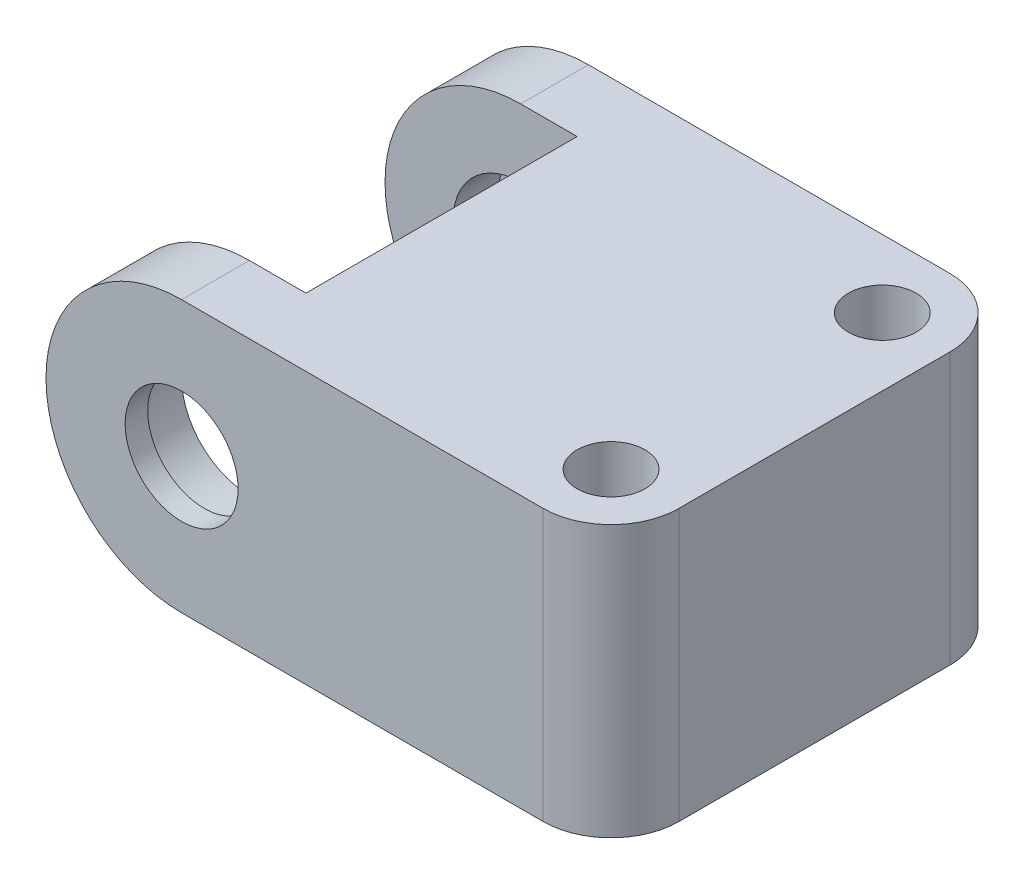
ISO-10303-21;
HEADER;
FILE_DESCRIPTION(('STEP AP214'),'2;1');
FILE_NAME('part.step','',(''),(''),'','','');
FILE_SCHEMA(('AUTOMOTIVE_DESIGN { 1 0 10303 214 1 1 1 1 }'));
ENDSEC;
DATA;
#1=APPLICATION_CONTEXT('core data for automotive mechanical design processes');
#2=APPLICATION_PROTOCOL_DEFINITION('international standard','automotive_design',2000,#1);
#3=PRODUCT_CONTEXT('',#1,'mechanical');
#4=PRODUCT('Part','Part','',(#3));
#5=PRODUCT_RELATED_PRODUCT_CATEGORY('part','',(#4));
#6=PRODUCT_DEFINITION_FORMATION('','',#4);
#7=PRODUCT_DEFINITION_CONTEXT('part definition',#1,'design');
#8=PRODUCT_DEFINITION('design','',#6,#7);
#9=PRODUCT_DEFINITION_SHAPE('','',#8);
#10=(LENGTH_UNIT() NAMED_UNIT(*) SI_UNIT(.MILLI.,.METRE.));
#11=(NAMED_UNIT(*) PLANE_ANGLE_UNIT() SI_UNIT($,.RADIAN.));
#12=(NAMED_UNIT(*) SI_UNIT($,.STERADIAN.) SOLID_ANGLE_UNIT());
#13=UNCERTAINTY_MEASURE_WITH_UNIT(LENGTH_MEASURE(1.E-05),#10,'distance_accuracy_value','');
#14=(GEOMETRIC_REPRESENTATION_CONTEXT(3) GLOBAL_UNCERTAINTY_ASSIGNED_CONTEXT((#13)) GLOBAL_UNIT_ASSIGNED_CONTEXT((#10,
#11,#12)) REPRESENTATION_CONTEXT('',''));
#15=CARTESIAN_POINT('',(0.,0.,0.));
#16=DIRECTION('',(0.,0.,1.));
#17=DIRECTION('',(1.,0.,0.));
#18=AXIS2_PLACEMENT_3D('',#15,#16,#17);
#19=CARTESIAN_POINT('',(0.,0.,9.));
#20=DIRECTION('',(0.,0.,-1.));
#21=DIRECTION('',(-1.,0.,0.));
#22=AXIS2_PLACEMENT_3D('',#19,#20,#21);
#23=CYLINDRICAL_SURFACE('',#22,6.);
#24=CARTESIAN_POINT('',(0.,0.,-6.));
#25=DIRECTION('',(0.,0.,-1.));
#26=DIRECTION('',(-1.,0.,0.));
#27=AXIS2_PLACEMENT_3D('',#24,#25,#26);
#28=CIRCLE('',#27,6.);
#29=CARTESIAN_POINT('',(0.,-6.,-6.));
#30=VERTEX_POINT('',#29);
#31=CARTESIAN_POINT('',(0.,6.,-6.));
#32=VERTEX_POINT('',#31);
#33=EDGE_CURVE('E184',#30,#32,#28,.T.);
#34=ORIENTED_EDGE('',*,*,#33,.T.);
#35=DIRECTION('',(0.,0.,1.));
#36=VECTOR('',#35,1.);
#37=CARTESIAN_POINT('',(0.,6.,9.));
#38=LINE('',#37,#36);
#39=CARTESIAN_POINT('',(0.,6.,-9.));
#40=VERTEX_POINT('',#39);
#41=EDGE_CURVE('E236',#40,#32,#38,.T.);
#42=ORIENTED_EDGE('',*,*,#41,.F.);
#43=CARTESIAN_POINT('',(0.,0.,-9.));
#44=DIRECTION('',(0.,0.,1.));
#45=DIRECTION('',(1.,0.,0.));
#46=AXIS2_PLACEMENT_3D('',#43,#44,#45);
#47=CIRCLE('',#46,6.);
#48=CARTESIAN_POINT('',(0.,-6.,-9.));
#49=VERTEX_POINT('',#48);
#50=EDGE_CURVE('E47',#40,#49,#47,.T.);
#51=ORIENTED_EDGE('',*,*,#50,.T.);
#52=DIRECTION('',(0.,0.,1.));
#53=VECTOR('',#52,1.);
#54=CARTESIAN_POINT('',(0.,-6.,9.));
#55=LINE('',#54,#53);
#56=EDGE_CURVE('E260',#49,#30,#55,.T.);
#57=ORIENTED_EDGE('',*,*,#56,.T.);
#58=EDGE_LOOP('',(#34,#42,#51,#57));
#59=FACE_BOUND('',#58,.T.);
#60=ADVANCED_FACE('F44',(#59),#23,.T.);
#61=CARTESIAN_POINT('',(16.,6.,-6.));
#62=DIRECTION('',(0.,-1.,0.));
#63=DIRECTION('',(0.,0.,-1.));
#64=AXIS2_PLACEMENT_3D('',#61,#62,#63);
#65=PLANE('',#64);
#66=CARTESIAN_POINT('',(16.,6.,6.));
#67=DIRECTION('',(0.,1.,0.));
#68=DIRECTION('',(0.,0.,1.));
#69=AXIS2_PLACEMENT_3D('',#66,#67,#68);
#70=CIRCLE('',#69,1.5);
#71=CARTESIAN_POINT('',(16.,6.,7.5));
#72=VERTEX_POINT('',#71);
#73=EDGE_CURVE('E218',#72,#72,#70,.T.);
#74=ORIENTED_EDGE('',*,*,#73,.F.);
#75=EDGE_LOOP('',(#74));
#76=FACE_BOUND('',#75,.T.);
#77=CARTESIAN_POINT('',(16.,6.,-6.));
#78=DIRECTION('',(0.,1.,0.));
#79=DIRECTION('',(0.,0.,1.));
#80=AXIS2_PLACEMENT_3D('',#77,#78,#79);
#81=CIRCLE('',#80,1.5);
#82=CARTESIAN_POINT('',(16.,6.,-4.5));
#83=VERTEX_POINT('',#82);
#84=EDGE_CURVE('E226',#83,#83,#81,.T.);
#85=ORIENTED_EDGE('',*,*,#84,.F.);
#86=EDGE_LOOP('',(#85));
#87=FACE_BOUND('',#86,.T.);
#88=DIRECTION('',(-1.,0.,0.));
#89=VECTOR('',#88,1.);
#90=CARTESIAN_POINT('',(-6.,6.,-6.));
#91=LINE('',#90,#89);
#92=CARTESIAN_POINT('',(2.5,6.,-6.));
#93=VERTEX_POINT('',#92);
#94=EDGE_CURVE('E148',#93,#32,#91,.T.);
#95=ORIENTED_EDGE('',*,*,#94,.F.);
#96=DIRECTION('',(0.,0.,-1.));
#97=VECTOR('',#96,1.);
#98=CARTESIAN_POINT('',(2.5,6.,-6.));
#99=LINE('',#98,#97);
#100=CARTESIAN_POINT('',(2.5,6.,6.));
#101=VERTEX_POINT('',#100);
#102=EDGE_CURVE('E147',#101,#93,#99,.T.);
#103=ORIENTED_EDGE('',*,*,#102,.F.);
#104=DIRECTION('',(1.,0.,0.));
#105=VECTOR('',#104,1.);
#106=CARTESIAN_POINT('',(2.5,6.,6.));
#107=LINE('',#106,#105);
#108=CARTESIAN_POINT('',(0.,6.,6.));
#109=VERTEX_POINT('',#108);
#110=EDGE_CURVE('E139',#109,#101,#107,.T.);
#111=ORIENTED_EDGE('',*,*,#110,.F.);
#112=CARTESIAN_POINT('',(0.,6.,9.));
#113=VERTEX_POINT('',#112);
#114=EDGE_CURVE('E239',#109,#113,#38,.T.);
#115=ORIENTED_EDGE('',*,*,#114,.T.);
#116=DIRECTION('',(1.,0.,0.));
#117=VECTOR('',#116,1.);
#118=CARTESIAN_POINT('',(16.,6.,9.));
#119=LINE('',#118,#117);
#120=CARTESIAN_POINT('',(16.,6.,9.));
#121=VERTEX_POINT('',#120);
#122=EDGE_CURVE('E237',#113,#121,#119,.T.);
#123=ORIENTED_EDGE('',*,*,#122,.T.);
#124=CARTESIAN_POINT('',(16.,6.,6.));
#125=DIRECTION('',(0.,1.,0.));
#126=DIRECTION('',(0.,0.,-1.));
#127=AXIS2_PLACEMENT_3D('',#124,#125,#126);
#128=CIRCLE('',#127,3.);
#129=CARTESIAN_POINT('',(19.,6.,6.));
#130=VERTEX_POINT('',#129);
#131=EDGE_CURVE('E243',#121,#130,#128,.T.);
#132=ORIENTED_EDGE('',*,*,#131,.T.);
#133=DIRECTION('',(0.,0.,-1.));
#134=VECTOR('',#133,1.);
#135=CARTESIAN_POINT('',(19.,6.,-6.));
#136=LINE('',#135,#134);
#137=CARTESIAN_POINT('',(19.,6.,-6.));
#138=VERTEX_POINT('',#137);
#139=EDGE_CURVE('E246',#130,#138,#136,.T.);
#140=ORIENTED_EDGE('',*,*,#139,.T.);
#141=CARTESIAN_POINT('',(16.,6.,-6.));
#142=DIRECTION('',(0.,1.,0.));
#143=DIRECTION('',(0.,0.,-1.));
#144=AXIS2_PLACEMENT_3D('',#141,#142,#143);
#145=CIRCLE('',#144,3.);
#146=CARTESIAN_POINT('',(16.,6.,-9.));
#147=VERTEX_POINT('',#146);
#148=EDGE_CURVE('E248',#138,#147,#145,.T.);
#149=ORIENTED_EDGE('',*,*,#148,.T.);
#150=DIRECTION('',(-1.,0.,0.));
#151=VECTOR('',#150,1.);
#152=CARTESIAN_POINT('',(0.,6.,-9.));
#153=LINE('',#152,#151);
#154=EDGE_CURVE('E255',#147,#40,#153,.T.);
#155=ORIENTED_EDGE('',*,*,#154,.T.);
#156=ORIENTED_EDGE('',*,*,#41,.T.);
#157=EDGE_LOOP('',(#95,#103,#111,#115,#123,#132,#140,#149,#155,#156));
#158=FACE_BOUND('',#157,.T.);
#159=ADVANCED_FACE('F160',(#76,#87,#158),#65,.F.);
#160=CARTESIAN_POINT('',(16.,-6.,-6.));
#161=DIRECTION('',(0.,-1.,0.));
#162=DIRECTION('',(0.,0.,-1.));
#163=AXIS2_PLACEMENT_3D('',#160,#161,#162);
#164=PLANE('',#163);
#165=CARTESIAN_POINT('',(16.,-6.,-6.));
#166=DIRECTION('',(0.,1.,0.));
#167=DIRECTION('',(0.,0.,1.));
#168=AXIS2_PLACEMENT_3D('',#165,#166,#167);
#169=CIRCLE('',#168,1.5);
#170=CARTESIAN_POINT('',(16.,-6.,-4.5));
#171=VERTEX_POINT('',#170);
#172=EDGE_CURVE('E223',#171,#171,#169,.T.);
#173=ORIENTED_EDGE('',*,*,#172,.T.);
#174=EDGE_LOOP('',(#173));
#175=FACE_BOUND('',#174,.T.);
#176=CARTESIAN_POINT('',(16.,-6.,6.));
#177=DIRECTION('',(0.,1.,0.));
#178=DIRECTION('',(0.,0.,1.));
#179=AXIS2_PLACEMENT_3D('',#176,#177,#178);
#180=CIRCLE('',#179,1.5);
#181=CARTESIAN_POINT('',(16.,-6.,7.5));
#182=VERTEX_POINT('',#181);
#183=EDGE_CURVE('E216',#182,#182,#180,.T.);
#184=ORIENTED_EDGE('',*,*,#183,.T.);
#185=EDGE_LOOP('',(#184));
#186=FACE_BOUND('',#185,.T.);
#187=DIRECTION('',(0.,0.,-1.));
#188=VECTOR('',#187,1.);
#189=CARTESIAN_POINT('',(2.5,-6.,-6.));
#190=LINE('',#189,#188);
#191=CARTESIAN_POINT('',(2.5,-6.,6.));
#192=VERTEX_POINT('',#191);
#193=CARTESIAN_POINT('',(2.5,-6.,-6.));
#194=VERTEX_POINT('',#193);
#195=EDGE_CURVE('E159',#192,#194,#190,.T.);
#196=ORIENTED_EDGE('',*,*,#195,.T.);
#197=DIRECTION('',(-1.,0.,0.));
#198=VECTOR('',#197,1.);
#199=CARTESIAN_POINT('',(-6.,-6.,-6.));
#200=LINE('',#199,#198);
#201=EDGE_CURVE('E61',#194,#30,#200,.T.);
#202=ORIENTED_EDGE('',*,*,#201,.T.);
#203=ORIENTED_EDGE('',*,*,#56,.F.);
#204=DIRECTION('',(-1.,0.,0.));
#205=VECTOR('',#204,1.);
#206=CARTESIAN_POINT('',(0.,-6.,-9.));
#207=LINE('',#206,#205);
#208=CARTESIAN_POINT('',(16.,-6.,-9.));
#209=VERTEX_POINT('',#208);
#210=EDGE_CURVE('E271',#209,#49,#207,.T.);
#211=ORIENTED_EDGE('',*,*,#210,.F.);
#212=CARTESIAN_POINT('',(16.,-6.,-6.));
#213=DIRECTION('',(0.,1.,0.));
#214=DIRECTION('',(0.,0.,-1.));
#215=AXIS2_PLACEMENT_3D('',#212,#213,#214);
#216=CIRCLE('',#215,3.);
#217=CARTESIAN_POINT('',(19.,-6.,-6.));
#218=VERTEX_POINT('',#217);
#219=EDGE_CURVE('E267',#218,#209,#216,.T.);
#220=ORIENTED_EDGE('',*,*,#219,.F.);
#221=DIRECTION('',(0.,0.,-1.));
#222=VECTOR('',#221,1.);
#223=CARTESIAN_POINT('',(19.,-6.,-6.));
#224=LINE('',#223,#222);
#225=CARTESIAN_POINT('',(19.,-6.,6.));
#226=VERTEX_POINT('',#225);
#227=EDGE_CURVE('E266',#226,#218,#224,.T.);
#228=ORIENTED_EDGE('',*,*,#227,.F.);
#229=CARTESIAN_POINT('',(16.,-6.,6.));
#230=DIRECTION('',(0.,1.,0.));
#231=DIRECTION('',(0.,0.,-1.));
#232=AXIS2_PLACEMENT_3D('',#229,#230,#231);
#233=CIRCLE('',#232,3.);
#234=CARTESIAN_POINT('',(16.,-6.,9.));
#235=VERTEX_POINT('',#234);
#236=EDGE_CURVE('E261',#235,#226,#233,.T.);
#237=ORIENTED_EDGE('',*,*,#236,.F.);
#238=DIRECTION('',(1.,0.,0.));
#239=VECTOR('',#238,1.);
#240=CARTESIAN_POINT('',(16.,-6.,9.));
#241=LINE('',#240,#239);
#242=CARTESIAN_POINT('',(0.,-6.,9.));
#243=VERTEX_POINT('',#242);
#244=EDGE_CURVE('E262',#243,#235,#241,.T.);
#245=ORIENTED_EDGE('',*,*,#244,.F.);
#246=CARTESIAN_POINT('',(0.,-6.,6.));
#247=VERTEX_POINT('',#246);
#248=EDGE_CURVE('E235',#247,#243,#55,.T.);
#249=ORIENTED_EDGE('',*,*,#248,.F.);
#250=DIRECTION('',(1.,0.,0.));
#251=VECTOR('',#250,1.);
#252=CARTESIAN_POINT('',(2.5,-6.,6.));
#253=LINE('',#252,#251);
#254=EDGE_CURVE('E165',#247,#192,#253,.T.);
#255=ORIENTED_EDGE('',*,*,#254,.T.);
#256=EDGE_LOOP('',(#196,#202,#203,#211,#220,#228,#237,#245,#249,#255));
#257=FACE_BOUND('',#256,.T.);
#258=ADVANCED_FACE('F308',(#175,#186,#257),#164,.T.);
#259=CARTESIAN_POINT('',(0.,0.,9.));
#260=DIRECTION('',(0.,0.,-1.));
#261=DIRECTION('',(-1.,0.,0.));
#262=AXIS2_PLACEMENT_3D('',#259,#260,#261);
#263=CYLINDRICAL_SURFACE('',#262,2.5);
#264=CARTESIAN_POINT('',(0.,0.,-9.));
#265=DIRECTION('',(0.,0.,1.));
#266=DIRECTION('',(1.,0.,0.));
#267=AXIS2_PLACEMENT_3D('',#264,#265,#266);
#268=CIRCLE('',#267,2.5);
#269=CARTESIAN_POINT('',(2.5,0.,-9.));
#270=VERTEX_POINT('',#269);
#271=EDGE_CURVE('E292',#270,#270,#268,.T.);
#272=ORIENTED_EDGE('',*,*,#271,.F.);
#273=EDGE_LOOP('',(#272));
#274=FACE_BOUND('',#273,.T.);
#275=CARTESIAN_POINT('',(0.,0.,-8.));
#276=DIRECTION('',(0.,0.,-1.));
#277=DIRECTION('',(-1.,0.,0.));
#278=AXIS2_PLACEMENT_3D('',#275,#276,#277);
#279=CIRCLE('',#278,2.5);
#280=CARTESIAN_POINT('',(-2.5,0.,-8.));
#281=VERTEX_POINT('',#280);
#282=EDGE_CURVE('E214',#281,#281,#279,.T.);
#283=ORIENTED_EDGE('',*,*,#282,.F.);
#284=EDGE_LOOP('',(#283));
#285=FACE_BOUND('',#284,.T.);
#286=ADVANCED_FACE('F302',(#274,#285),#263,.F.);
#287=CARTESIAN_POINT('',(0.,0.,8.));
#288=DIRECTION('',(0.,0.,-1.));
#289=DIRECTION('',(-1.,0.,0.));
#290=AXIS2_PLACEMENT_3D('',#287,#288,#289);
#291=CIRCLE('',#290,2.5);
#292=CARTESIAN_POINT('',(-2.5,0.,8.));
#293=VERTEX_POINT('',#292);
#294=EDGE_CURVE('E189',#293,#293,#291,.T.);
#295=ORIENTED_EDGE('',*,*,#294,.T.);
#296=EDGE_LOOP('',(#295));
#297=FACE_BOUND('',#296,.T.);
#298=CARTESIAN_POINT('',(0.,0.,9.));
#299=DIRECTION('',(0.,0.,1.));
#300=DIRECTION('',(1.,0.,0.));
#301=AXIS2_PLACEMENT_3D('',#298,#299,#300);
#302=CIRCLE('',#301,2.5);
#303=CARTESIAN_POINT('',(2.5,0.,9.));
#304=VERTEX_POINT('',#303);
#305=EDGE_CURVE('E291',#304,#304,#302,.T.);
#306=ORIENTED_EDGE('',*,*,#305,.T.);
#307=EDGE_LOOP('',(#306));
#308=FACE_BOUND('',#307,.T.);
#309=ADVANCED_FACE('F310',(#297,#308),#263,.F.);
#310=ORIENTED_EDGE('',*,*,#114,.F.);
#311=CARTESIAN_POINT('',(0.,0.,6.));
#312=DIRECTION('',(0.,0.,1.));
#313=DIRECTION('',(1.,0.,0.));
#314=AXIS2_PLACEMENT_3D('',#311,#312,#313);
#315=CIRCLE('',#314,6.);
#316=EDGE_CURVE('E141',#109,#247,#315,.T.);
#317=ORIENTED_EDGE('',*,*,#316,.T.);
#318=ORIENTED_EDGE('',*,*,#248,.T.);
#319=CARTESIAN_POINT('',(0.,0.,9.));
#320=DIRECTION('',(0.,0.,1.));
#321=DIRECTION('',(1.,0.,0.));
#322=AXIS2_PLACEMENT_3D('',#319,#320,#321);
#323=CIRCLE('',#322,6.);
#324=EDGE_CURVE('E11',#113,#243,#323,.T.);
#325=ORIENTED_EDGE('',*,*,#324,.F.);
#326=EDGE_LOOP('',(#310,#317,#318,#325));
#327=FACE_BOUND('',#326,.T.);
#328=ADVANCED_FACE('F50',(#327),#23,.T.);
#329=CARTESIAN_POINT('',(0.,0.,9.));
#330=DIRECTION('',(0.,0.,1.));
#331=DIRECTION('',(1.,0.,0.));
#332=AXIS2_PLACEMENT_3D('',#329,#330,#331);
#333=PLANE('',#332);
#334=ORIENTED_EDGE('',*,*,#305,.F.);
#335=EDGE_LOOP('',(#334));
#336=FACE_BOUND('',#335,.T.);
#337=ORIENTED_EDGE('',*,*,#324,.T.);
#338=ORIENTED_EDGE('',*,*,#244,.T.);
#339=DIRECTION('',(0.,-1.,0.));
#340=VECTOR('',#339,1.);
#341=CARTESIAN_POINT('',(16.,6.,9.));
#342=LINE('',#341,#340);
#343=EDGE_CURVE('E290',#121,#235,#342,.T.);
#344=ORIENTED_EDGE('',*,*,#343,.F.);
#345=ORIENTED_EDGE('',*,*,#122,.F.);
#346=EDGE_LOOP('',(#337,#338,#344,#345));
#347=FACE_BOUND('',#346,.T.);
#348=ADVANCED_FACE('F350',(#336,#347),#333,.T.);
#349=CARTESIAN_POINT('',(0.,0.,-9.));
#350=DIRECTION('',(0.,0.,1.));
#351=DIRECTION('',(1.,0.,0.));
#352=AXIS2_PLACEMENT_3D('',#349,#350,#351);
#353=PLANE('',#352);
#354=ORIENTED_EDGE('',*,*,#271,.T.);
#355=EDGE_LOOP('',(#354));
#356=FACE_BOUND('',#355,.T.);
#357=ORIENTED_EDGE('',*,*,#50,.F.);
#358=ORIENTED_EDGE('',*,*,#154,.F.);
#359=DIRECTION('',(0.,-1.,0.));
#360=VECTOR('',#359,1.);
#361=CARTESIAN_POINT('',(16.,6.,-9.));
#362=LINE('',#361,#360);
#363=EDGE_CURVE('E256',#147,#209,#362,.T.);
#364=ORIENTED_EDGE('',*,*,#363,.T.);
#365=ORIENTED_EDGE('',*,*,#210,.T.);
#366=EDGE_LOOP('',(#357,#358,#364,#365));
#367=FACE_BOUND('',#366,.T.);
#368=ADVANCED_FACE('F301',(#356,#367),#353,.F.);
#369=CARTESIAN_POINT('',(16.,6.,6.));
#370=DIRECTION('',(0.,-1.,0.));
#371=DIRECTION('',(0.,0.,-1.));
#372=AXIS2_PLACEMENT_3D('',#369,#370,#371);
#373=CYLINDRICAL_SURFACE('',#372,3.);
#374=ORIENTED_EDGE('',*,*,#236,.T.);
#375=DIRECTION('',(0.,-1.,0.));
#376=VECTOR('',#375,1.);
#377=CARTESIAN_POINT('',(19.,6.,6.));
#378=LINE('',#377,#376);
#379=EDGE_CURVE('E281',#130,#226,#378,.T.);
#380=ORIENTED_EDGE('',*,*,#379,.F.);
#381=ORIENTED_EDGE('',*,*,#131,.F.);
#382=ORIENTED_EDGE('',*,*,#343,.T.);
#383=EDGE_LOOP('',(#374,#380,#381,#382));
#384=FACE_BOUND('',#383,.T.);
#385=ADVANCED_FACE('F354',(#384),#373,.T.);
#386=CARTESIAN_POINT('',(19.,6.,-6.));
#387=DIRECTION('',(-1.,0.,0.));
#388=DIRECTION('',(0.,0.,1.));
#389=AXIS2_PLACEMENT_3D('',#386,#387,#388);
#390=PLANE('',#389);
#391=ORIENTED_EDGE('',*,*,#227,.T.);
#392=DIRECTION('',(0.,-1.,0.));
#393=VECTOR('',#392,1.);
#394=CARTESIAN_POINT('',(19.,6.,-6.));
#395=LINE('',#394,#393);
#396=EDGE_CURVE('E279',#138,#218,#395,.T.);
#397=ORIENTED_EDGE('',*,*,#396,.F.);
#398=ORIENTED_EDGE('',*,*,#139,.F.);
#399=ORIENTED_EDGE('',*,*,#379,.T.);
#400=EDGE_LOOP('',(#391,#397,#398,#399));
#401=FACE_BOUND('',#400,.T.);
#402=ADVANCED_FACE('F357',(#401),#390,.F.);
#403=CARTESIAN_POINT('',(16.,6.,-6.));
#404=DIRECTION('',(0.,-1.,0.));
#405=DIRECTION('',(0.,0.,-1.));
#406=AXIS2_PLACEMENT_3D('',#403,#404,#405);
#407=CYLINDRICAL_SURFACE('',#406,3.);
#408=ORIENTED_EDGE('',*,*,#219,.T.);
#409=ORIENTED_EDGE('',*,*,#363,.F.);
#410=ORIENTED_EDGE('',*,*,#148,.F.);
#411=ORIENTED_EDGE('',*,*,#396,.T.);
#412=EDGE_LOOP('',(#408,#409,#410,#411));
#413=FACE_BOUND('',#412,.T.);
#414=ADVANCED_FACE('F363',(#413),#407,.T.);
#415=CARTESIAN_POINT('',(16.,6.,-6.));
#416=DIRECTION('',(0.,-1.,0.));
#417=DIRECTION('',(0.,0.,-1.));
#418=AXIS2_PLACEMENT_3D('',#415,#416,#417);
#419=CYLINDRICAL_SURFACE('',#418,1.5);
#420=ORIENTED_EDGE('',*,*,#84,.T.);
#421=EDGE_LOOP('',(#420));
#422=FACE_BOUND('',#421,.T.);
#423=ORIENTED_EDGE('',*,*,#172,.F.);
#424=EDGE_LOOP('',(#423));
#425=FACE_BOUND('',#424,.T.);
#426=ADVANCED_FACE('F397',(#422,#425),#419,.F.);
#427=CARTESIAN_POINT('',(16.,6.,6.));
#428=DIRECTION('',(0.,-1.,0.));
#429=DIRECTION('',(0.,0.,-1.));
#430=AXIS2_PLACEMENT_3D('',#427,#428,#429);
#431=CYLINDRICAL_SURFACE('',#430,1.5);
#432=ORIENTED_EDGE('',*,*,#73,.T.);
#433=EDGE_LOOP('',(#432));
#434=FACE_BOUND('',#433,.T.);
#435=ORIENTED_EDGE('',*,*,#183,.F.);
#436=EDGE_LOOP('',(#435));
#437=FACE_BOUND('',#436,.T.);
#438=ADVANCED_FACE('F317',(#434,#437),#431,.F.);
#439=CARTESIAN_POINT('',(2.5,0.,-8.));
#440=DIRECTION('',(0.,0.,1.));
#441=DIRECTION('',(1.,0.,0.));
#442=AXIS2_PLACEMENT_3D('',#439,#440,#441);
#443=PLANE('',#442);
#444=ORIENTED_EDGE('',*,*,#282,.T.);
#445=EDGE_LOOP('',(#444));
#446=FACE_BOUND('',#445,.T.);
#447=CARTESIAN_POINT('',(0.,0.,-8.));
#448=DIRECTION('',(0.,0.,-1.));
#449=DIRECTION('',(-1.,0.,0.));
#450=AXIS2_PLACEMENT_3D('',#447,#448,#449);
#451=CIRCLE('',#450,3.);
#452=CARTESIAN_POINT('',(-3.,0.,-8.));
#453=VERTEX_POINT('',#452);
#454=EDGE_CURVE('E211',#453,#453,#451,.T.);
#455=ORIENTED_EDGE('',*,*,#454,.F.);
#456=EDGE_LOOP('',(#455));
#457=FACE_BOUND('',#456,.T.);
#458=ADVANCED_FACE('F315',(#446,#457),#443,.T.);
#459=CARTESIAN_POINT('',(0.,0.,-12.234149703983));
#460=DIRECTION('',(0.,0.,-1.));
#461=DIRECTION('',(-1.,0.,0.));
#462=AXIS2_PLACEMENT_3D('',#459,#460,#461);
#463=CYLINDRICAL_SURFACE('',#462,3.);
#464=ORIENTED_EDGE('',*,*,#454,.T.);
#465=EDGE_LOOP('',(#464));
#466=FACE_BOUND('',#465,.T.);
#467=CARTESIAN_POINT('',(0.,0.,-6.));
#468=DIRECTION('',(0.,0.,-1.));
#469=DIRECTION('',(-1.,0.,0.));
#470=AXIS2_PLACEMENT_3D('',#467,#468,#469);
#471=CIRCLE('',#470,3.);
#472=CARTESIAN_POINT('',(-3.,0.,-6.));
#473=VERTEX_POINT('',#472);
#474=EDGE_CURVE('E210',#473,#473,#471,.T.);
#475=ORIENTED_EDGE('',*,*,#474,.F.);
#476=EDGE_LOOP('',(#475));
#477=FACE_BOUND('',#476,.T.);
#478=ADVANCED_FACE('F314',(#466,#477),#463,.F.);
#479=CARTESIAN_POINT('',(3.,0.,-6.));
#480=DIRECTION('',(0.,0.,1.));
#481=DIRECTION('',(1.,0.,0.));
#482=AXIS2_PLACEMENT_3D('',#479,#480,#481);
#483=PLANE('',#482);
#484=ORIENTED_EDGE('',*,*,#474,.T.);
#485=EDGE_LOOP('',(#484));
#486=FACE_BOUND('',#485,.T.);
#487=CARTESIAN_POINT('',(0.,0.,-6.));
#488=DIRECTION('',(0.,0.,-1.));
#489=DIRECTION('',(-1.,0.,0.));
#490=AXIS2_PLACEMENT_3D('',#487,#488,#489);
#491=CIRCLE('',#490,4.5);
#492=CARTESIAN_POINT('',(2.5,3.74165738677394,-6.));
#493=VERTEX_POINT('',#492);
#494=CARTESIAN_POINT('',(2.5,-3.74165738677394,-6.));
#495=VERTEX_POINT('',#494);
#496=EDGE_CURVE('E205',#493,#495,#491,.T.);
#497=ORIENTED_EDGE('',*,*,#496,.F.);
#498=DIRECTION('',(0.,1.,0.));
#499=VECTOR('',#498,1.);
#500=CARTESIAN_POINT('',(2.5,-6.,-6.));
#501=LINE('',#500,#499);
#502=EDGE_CURVE('E66',#493,#93,#501,.T.);
#503=ORIENTED_EDGE('',*,*,#502,.T.);
#504=ORIENTED_EDGE('',*,*,#94,.T.);
#505=ORIENTED_EDGE('',*,*,#33,.F.);
#506=ORIENTED_EDGE('',*,*,#201,.F.);
#507=EDGE_CURVE('E172',#194,#495,#501,.T.);
#508=ORIENTED_EDGE('',*,*,#507,.T.);
#509=EDGE_LOOP('',(#497,#503,#504,#505,#506,#508));
#510=FACE_BOUND('',#509,.T.);
#511=ADVANCED_FACE('F325',(#486,#510),#483,.T.);
#512=CARTESIAN_POINT('',(0.,0.,-12.234149703983));
#513=DIRECTION('',(0.,0.,-1.));
#514=DIRECTION('',(-1.,0.,0.));
#515=AXIS2_PLACEMENT_3D('',#512,#513,#514);
#516=CYLINDRICAL_SURFACE('',#515,4.5);
#517=DIRECTION('',(0.,0.,-1.));
#518=VECTOR('',#517,1.);
#519=CARTESIAN_POINT('',(2.5,-3.74165738677394,-12.234149703983));
#520=LINE('',#519,#518);
#521=CARTESIAN_POINT('',(2.5,-3.74165738677394,6.));
#522=VERTEX_POINT('',#521);
#523=EDGE_CURVE('E185',#522,#495,#520,.T.);
#524=ORIENTED_EDGE('',*,*,#523,.F.);
#525=CARTESIAN_POINT('',(0.,0.,6.));
#526=DIRECTION('',(0.,0.,-1.));
#527=DIRECTION('',(-1.,0.,0.));
#528=AXIS2_PLACEMENT_3D('',#525,#526,#527);
#529=CIRCLE('',#528,4.5);
#530=CARTESIAN_POINT('',(2.5,3.74165738677394,6.));
#531=VERTEX_POINT('',#530);
#532=EDGE_CURVE('E198',#531,#522,#529,.T.);
#533=ORIENTED_EDGE('',*,*,#532,.F.);
#534=DIRECTION('',(0.,0.,-1.));
#535=VECTOR('',#534,1.);
#536=CARTESIAN_POINT('',(2.5,3.74165738677394,-12.234149703983));
#537=LINE('',#536,#535);
#538=EDGE_CURVE('E154',#493,#531,#537,.F.);
#539=ORIENTED_EDGE('',*,*,#538,.F.);
#540=ORIENTED_EDGE('',*,*,#496,.T.);
#541=EDGE_LOOP('',(#524,#533,#539,#540));
#542=FACE_BOUND('',#541,.T.);
#543=ADVANCED_FACE('F330',(#542),#516,.F.);
#544=CARTESIAN_POINT('',(4.5,0.,6.));
#545=DIRECTION('',(0.,0.,-1.));
#546=DIRECTION('',(-1.,0.,0.));
#547=AXIS2_PLACEMENT_3D('',#544,#545,#546);
#548=PLANE('',#547);
#549=CARTESIAN_POINT('',(0.,0.,6.));
#550=DIRECTION('',(0.,0.,-1.));
#551=DIRECTION('',(-1.,0.,0.));
#552=AXIS2_PLACEMENT_3D('',#549,#550,#551);
#553=CIRCLE('',#552,3.);
#554=CARTESIAN_POINT('',(-3.,0.,6.));
#555=VERTEX_POINT('',#554);
#556=EDGE_CURVE('E197',#555,#555,#553,.T.);
#557=ORIENTED_EDGE('',*,*,#556,.F.);
#558=EDGE_LOOP('',(#557));
#559=FACE_BOUND('',#558,.T.);
#560=ORIENTED_EDGE('',*,*,#532,.T.);
#561=DIRECTION('',(0.,1.,0.));
#562=VECTOR('',#561,1.);
#563=CARTESIAN_POINT('',(2.5,-6.,6.));
#564=LINE('',#563,#562);
#565=EDGE_CURVE('E153',#192,#522,#564,.T.);
#566=ORIENTED_EDGE('',*,*,#565,.F.);
#567=ORIENTED_EDGE('',*,*,#254,.F.);
#568=ORIENTED_EDGE('',*,*,#316,.F.);
#569=ORIENTED_EDGE('',*,*,#110,.T.);
#570=EDGE_CURVE('E137',#531,#101,#564,.T.);
#571=ORIENTED_EDGE('',*,*,#570,.F.);
#572=EDGE_LOOP('',(#560,#566,#567,#568,#569,#571));
#573=FACE_BOUND('',#572,.T.);
#574=ADVANCED_FACE('F138',(#559,#573),#548,.T.);
#575=CARTESIAN_POINT('',(0.,0.,-12.234149703983));
#576=DIRECTION('',(0.,0.,-1.));
#577=DIRECTION('',(-1.,0.,0.));
#578=AXIS2_PLACEMENT_3D('',#575,#576,#577);
#579=CYLINDRICAL_SURFACE('',#578,3.);
#580=ORIENTED_EDGE('',*,*,#556,.T.);
#581=EDGE_LOOP('',(#580));
#582=FACE_BOUND('',#581,.T.);
#583=CARTESIAN_POINT('',(0.,0.,8.));
#584=DIRECTION('',(0.,0.,-1.));
#585=DIRECTION('',(-1.,0.,0.));
#586=AXIS2_PLACEMENT_3D('',#583,#584,#585);
#587=CIRCLE('',#586,3.);
#588=CARTESIAN_POINT('',(-3.,0.,8.));
#589=VERTEX_POINT('',#588);
#590=EDGE_CURVE('E195',#589,#589,#587,.T.);
#591=ORIENTED_EDGE('',*,*,#590,.F.);
#592=EDGE_LOOP('',(#591));
#593=FACE_BOUND('',#592,.T.);
#594=ADVANCED_FACE('F413',(#582,#593),#579,.F.);
#595=CARTESIAN_POINT('',(3.,0.,8.));
#596=DIRECTION('',(0.,0.,-1.));
#597=DIRECTION('',(-1.,0.,0.));
#598=AXIS2_PLACEMENT_3D('',#595,#596,#597);
#599=PLANE('',#598);
#600=ORIENTED_EDGE('',*,*,#590,.T.);
#601=EDGE_LOOP('',(#600));
#602=FACE_BOUND('',#601,.T.);
#603=ORIENTED_EDGE('',*,*,#294,.F.);
#604=EDGE_LOOP('',(#603));
#605=FACE_BOUND('',#604,.T.);
#606=ADVANCED_FACE('F418',(#602,#605),#599,.T.);
#607=CARTESIAN_POINT('',(2.5,-6.,-6.));
#608=DIRECTION('',(1.,0.,0.));
#609=DIRECTION('',(0.,0.,-1.));
#610=AXIS2_PLACEMENT_3D('',#607,#608,#609);
#611=PLANE('',#610);
#612=ORIENTED_EDGE('',*,*,#523,.T.);
#613=ORIENTED_EDGE('',*,*,#507,.F.);
#614=ORIENTED_EDGE('',*,*,#195,.F.);
#615=ORIENTED_EDGE('',*,*,#565,.T.);
#616=EDGE_LOOP('',(#612,#613,#614,#615));
#617=FACE_BOUND('',#616,.T.);
#618=ADVANCED_FACE('F332',(#617),#611,.F.);
#619=ORIENTED_EDGE('',*,*,#538,.T.);
#620=ORIENTED_EDGE('',*,*,#570,.T.);
#621=ORIENTED_EDGE('',*,*,#102,.T.);
#622=ORIENTED_EDGE('',*,*,#502,.F.);
#623=EDGE_LOOP('',(#619,#620,#621,#622));
#624=FACE_BOUND('',#623,.T.);
#625=ADVANCED_FACE('F152',(#624),#611,.F.);
#626=CLOSED_SHELL('',(#60,#159,#258,#286,#309,#328,#348,#368,#385,#402,#414,#426,#438,#458,#478,
#511,#543,#574,#594,#606,#618,#625));
#627=MANIFOLD_SOLID_BREP('B2',#626);
#628=ADVANCED_BREP_SHAPE_REPRESENTATION('',(#18,#627),#14);
#629=SHAPE_DEFINITION_REPRESENTATION(#9,#628);
ENDSEC;
END-ISO-10303-21;
